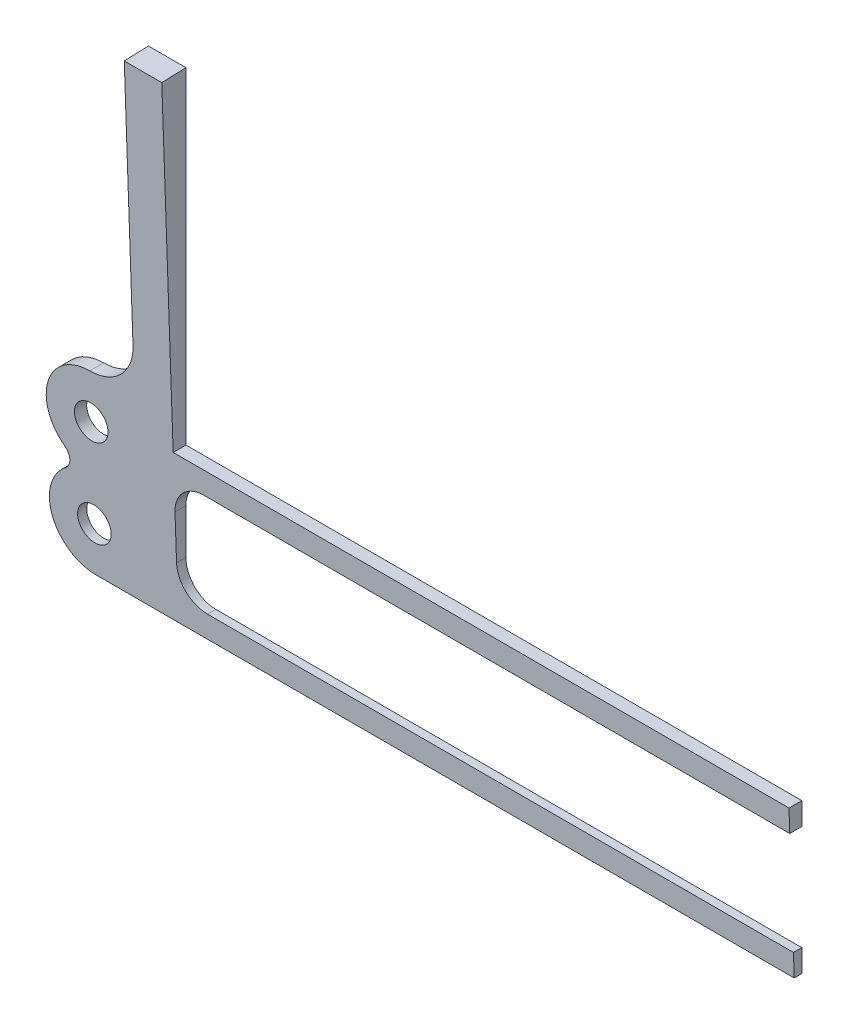
ISO-10303-21;
HEADER;
FILE_DESCRIPTION(('STEP AP214'),'2;1');
FILE_NAME('part.step','',(''),(''),'','','');
FILE_SCHEMA(('AUTOMOTIVE_DESIGN { 1 0 10303 214 1 1 1 1 }'));
ENDSEC;
DATA;
#1=APPLICATION_CONTEXT('core data for automotive mechanical design processes');
#2=APPLICATION_PROTOCOL_DEFINITION('international standard','automotive_design',2000,#1);
#3=PRODUCT_CONTEXT('',#1,'mechanical');
#4=PRODUCT('Part','Part','',(#3));
#5=PRODUCT_RELATED_PRODUCT_CATEGORY('part','',(#4));
#6=PRODUCT_DEFINITION_FORMATION('','',#4);
#7=PRODUCT_DEFINITION_CONTEXT('part definition',#1,'design');
#8=PRODUCT_DEFINITION('design','',#6,#7);
#9=PRODUCT_DEFINITION_SHAPE('','',#8);
#10=(LENGTH_UNIT() NAMED_UNIT(*) SI_UNIT(.MILLI.,.METRE.));
#11=(NAMED_UNIT(*) PLANE_ANGLE_UNIT() SI_UNIT($,.RADIAN.));
#12=(NAMED_UNIT(*) SI_UNIT($,.STERADIAN.) SOLID_ANGLE_UNIT());
#13=UNCERTAINTY_MEASURE_WITH_UNIT(LENGTH_MEASURE(1.E-05),#10,'distance_accuracy_value','');
#14=(GEOMETRIC_REPRESENTATION_CONTEXT(3) GLOBAL_UNCERTAINTY_ASSIGNED_CONTEXT((#13)) GLOBAL_UNIT_ASSIGNED_CONTEXT((#10,
#11,#12)) REPRESENTATION_CONTEXT('',''));
#15=CARTESIAN_POINT('',(0.,0.,0.));
#16=DIRECTION('',(0.,0.,1.));
#17=DIRECTION('',(1.,0.,0.));
#18=AXIS2_PLACEMENT_3D('',#15,#16,#17);
#19=CARTESIAN_POINT('',(0.,9.52500000000004,76.2));
#20=DIRECTION('',(0.,-1.,0.));
#21=DIRECTION('',(1.,0.,0.));
#22=AXIS2_PLACEMENT_3D('',#19,#20,#21);
#23=PLANE('',#22);
#24=DIRECTION('',(1.,0.,0.));
#25=VECTOR('',#24,1.);
#26=CARTESIAN_POINT('',(0.,9.52500000000004,2.70893443136311));
#27=LINE('',#26,#25);
#28=CARTESIAN_POINT('',(-268.897099999997,9.52500000000005,2.7089344313631));
#29=VERTEX_POINT('',#28);
#30=CARTESIAN_POINT('',(-138.423649999999,9.52500000000006,2.7089344313631));
#31=VERTEX_POINT('',#30);
#32=EDGE_CURVE('E169',#29,#31,#27,.T.);
#33=ORIENTED_EDGE('',*,*,#32,.T.);
#34=DIRECTION('',(0.,0.,-1.));
#35=VECTOR('',#34,1.);
#36=CARTESIAN_POINT('',(-138.423649999999,9.52500000000004,76.2));
#37=LINE('',#36,#35);
#38=CARTESIAN_POINT('',(-138.423649999999,9.52500000000005,0.));
#39=VERTEX_POINT('',#38);
#40=EDGE_CURVE('E316',#31,#39,#37,.T.);
#41=ORIENTED_EDGE('',*,*,#40,.T.);
#42=DIRECTION('',(-1.,0.,0.));
#43=VECTOR('',#42,1.);
#44=CARTESIAN_POINT('',(0.,9.52500000000004,0.));
#45=LINE('',#44,#43);
#46=CARTESIAN_POINT('',(-268.897099999997,9.52500000000005,0.));
#47=VERTEX_POINT('',#46);
#48=EDGE_CURVE('E197',#39,#47,#45,.T.);
#49=ORIENTED_EDGE('',*,*,#48,.T.);
#50=DIRECTION('',(0.,0.,-1.));
#51=VECTOR('',#50,1.);
#52=CARTESIAN_POINT('',(-268.897099999997,9.52500000000005,76.2));
#53=LINE('',#52,#51);
#54=EDGE_CURVE('E207',#29,#47,#53,.T.);
#55=ORIENTED_EDGE('',*,*,#54,.F.);
#56=EDGE_LOOP('',(#33,#41,#49,#55));
#57=FACE_BOUND('',#56,.T.);
#58=ADVANCED_FACE('F35',(#57),#23,.F.);
#59=CARTESIAN_POINT('',(-268.897099999997,0.,76.2));
#60=DIRECTION('',(-1.,0.,0.));
#61=DIRECTION('',(0.,0.,1.));
#62=AXIS2_PLACEMENT_3D('',#59,#60,#61);
#63=PLANE('',#62);
#64=DIRECTION('',(0.,1.,0.));
#65=VECTOR('',#64,1.);
#66=CARTESIAN_POINT('',(-268.897099999997,0.,0.));
#67=LINE('',#66,#65);
#68=CARTESIAN_POINT('',(-268.897099999997,78.7664171628417,0.));
#69=VERTEX_POINT('',#68);
#70=EDGE_CURVE('E162',#47,#69,#67,.T.);
#71=ORIENTED_EDGE('',*,*,#70,.T.);
#72=DIRECTION('',(0.,-0.0348994967025044,0.999390827019096));
#73=VECTOR('',#72,1.);
#74=CARTESIAN_POINT('',(-268.897099999997,76.012759996479,78.8544240702688));
#75=LINE('',#74,#73);
#76=CARTESIAN_POINT('',(-268.897099999997,78.5876000000001,5.12065356646412));
#77=VERTEX_POINT('',#76);
#78=EDGE_CURVE('E148',#69,#77,#75,.T.);
#79=ORIENTED_EDGE('',*,*,#78,.T.);
#80=DIRECTION('',(0.,-0.999390827019096,-0.0348994967025044));
#81=VECTOR('',#80,1.);
#82=CARTESIAN_POINT('',(-268.897099999997,2.57484000352105,2.46622949619527));
#83=LINE('',#82,#81);
#84=EDGE_CURVE('E159',#77,#29,#83,.T.);
#85=ORIENTED_EDGE('',*,*,#84,.T.);
#86=ORIENTED_EDGE('',*,*,#54,.T.);
#87=EDGE_LOOP('',(#71,#79,#85,#86));
#88=FACE_BOUND('',#87,.T.);
#89=ADVANCED_FACE('F157',(#88),#63,.F.);
#90=CARTESIAN_POINT('',(0.,-22.225,76.2));
#91=DIRECTION('',(0.,1.,0.));
#92=DIRECTION('',(0.,0.,1.));
#93=AXIS2_PLACEMENT_3D('',#90,#91,#92);
#94=PLANE('',#93);
#95=DIRECTION('',(1.,0.,0.));
#96=VECTOR('',#95,1.);
#97=CARTESIAN_POINT('',(0.,-22.225,0.));
#98=LINE('',#97,#96);
#99=CARTESIAN_POINT('',(-286.359599999998,-22.225,0.));
#100=VERTEX_POINT('',#99);
#101=CARTESIAN_POINT('',(-138.423649999999,-22.225,0.));
#102=VERTEX_POINT('',#101);
#103=EDGE_CURVE('E184',#100,#102,#98,.T.);
#104=ORIENTED_EDGE('',*,*,#103,.T.);
#105=DIRECTION('',(0.,0.,1.));
#106=VECTOR('',#105,1.);
#107=CARTESIAN_POINT('',(-138.423649999999,-22.225,76.2));
#108=LINE('',#107,#106);
#109=CARTESIAN_POINT('',(-138.423649999999,-22.225,1.6002));
#110=VERTEX_POINT('',#109);
#111=EDGE_CURVE('E272',#102,#110,#108,.T.);
#112=ORIENTED_EDGE('',*,*,#111,.T.);
#113=DIRECTION('',(-1.,0.,0.));
#114=VECTOR('',#113,1.);
#115=CARTESIAN_POINT('',(19.0500000000025,-22.225,1.6002));
#116=LINE('',#115,#114);
#117=CARTESIAN_POINT('',(-286.359599999998,-22.225,1.6002));
#118=VERTEX_POINT('',#117);
#119=EDGE_CURVE('E281',#110,#118,#116,.T.);
#120=ORIENTED_EDGE('',*,*,#119,.T.);
#121=DIRECTION('',(0.,0.,-1.));
#122=VECTOR('',#121,1.);
#123=CARTESIAN_POINT('',(-286.359599999998,-22.225,76.2));
#124=LINE('',#123,#122);
#125=EDGE_CURVE('E206',#118,#100,#124,.T.);
#126=ORIENTED_EDGE('',*,*,#125,.T.);
#127=EDGE_LOOP('',(#104,#112,#120,#126));
#128=FACE_BOUND('',#127,.T.);
#129=ADVANCED_FACE('F311',(#128),#94,.F.);
#130=CARTESIAN_POINT('',(-276.847299999997,0.,76.2));
#131=DIRECTION('',(1.,0.,0.));
#132=DIRECTION('',(0.,0.,-1.));
#133=AXIS2_PLACEMENT_3D('',#130,#131,#132);
#134=PLANE('',#133);
#135=DIRECTION('',(0.,0.999390827019096,0.0348994967025044));
#136=VECTOR('',#135,1.);
#137=CARTESIAN_POINT('',(-276.847299999997,2.57484000352105,2.46622949619527));
#138=LINE('',#137,#136);
#139=CARTESIAN_POINT('',(-276.847299999997,25.4,3.26330164704465));
#140=VERTEX_POINT('',#139);
#141=CARTESIAN_POINT('',(-276.847299999997,78.5876000000001,5.12065356646412));
#142=VERTEX_POINT('',#141);
#143=EDGE_CURVE('E171',#140,#142,#138,.T.);
#144=ORIENTED_EDGE('',*,*,#143,.T.);
#145=DIRECTION('',(0.,0.0348994967025044,-0.999390827019096));
#146=VECTOR('',#145,1.);
#147=CARTESIAN_POINT('',(-276.847299999997,76.012759996479,78.8544240702688));
#148=LINE('',#147,#146);
#149=CARTESIAN_POINT('',(-276.847299999997,78.7664171628417,0.));
#150=VERTEX_POINT('',#149);
#151=EDGE_CURVE('E50',#142,#150,#148,.T.);
#152=ORIENTED_EDGE('',*,*,#151,.T.);
#153=DIRECTION('',(0.,-1.,0.));
#154=VECTOR('',#153,1.);
#155=CARTESIAN_POINT('',(-276.847299999997,0.,0.));
#156=LINE('',#155,#154);
#157=CARTESIAN_POINT('',(-276.847299999997,25.4,0.));
#158=VERTEX_POINT('',#157);
#159=EDGE_CURVE('E187',#150,#158,#156,.T.);
#160=ORIENTED_EDGE('',*,*,#159,.T.);
#161=DIRECTION('',(0.,0.,-1.));
#162=VECTOR('',#161,1.);
#163=CARTESIAN_POINT('',(-276.847299999997,25.4,76.2));
#164=LINE('',#163,#162);
#165=EDGE_CURVE('E210',#140,#158,#164,.T.);
#166=ORIENTED_EDGE('',*,*,#165,.F.);
#167=EDGE_LOOP('',(#144,#152,#160,#166));
#168=FACE_BOUND('',#167,.T.);
#169=ADVANCED_FACE('F327',(#168),#134,.F.);
#170=CARTESIAN_POINT('',(-286.372299999997,25.4,76.2));
#171=DIRECTION('',(0.,0.,-1.));
#172=DIRECTION('',(-1.,0.,0.));
#173=AXIS2_PLACEMENT_3D('',#170,#171,#172);
#174=CYLINDRICAL_SURFACE('',#173,9.525);
#175=CARTESIAN_POINT('',(-286.372299999997,25.4,3.26330164704465));
#176=DIRECTION('',(0.,0.0348994967025044,-0.999390827019096));
#177=DIRECTION('',(0.,-0.999390827019096,-0.0348994967025044));
#178=AXIS2_PLACEMENT_3D('',#175,#176,#177);
#179=ELLIPSE('',#178,9.53080590944628,9.525);
#180=CARTESIAN_POINT('',(-286.372299999997,15.875,2.93068131763571));
#181=VERTEX_POINT('',#180);
#182=EDGE_CURVE('E175',#140,#181,#179,.T.);
#183=ORIENTED_EDGE('',*,*,#182,.F.);
#184=ORIENTED_EDGE('',*,*,#165,.T.);
#185=CARTESIAN_POINT('',(-286.372299999997,25.4,0.));
#186=DIRECTION('',(0.,0.,1.));
#187=DIRECTION('',(1.,0.,0.));
#188=AXIS2_PLACEMENT_3D('',#185,#186,#187);
#189=CIRCLE('',#188,9.525);
#190=CARTESIAN_POINT('',(-286.372299999997,15.875,0.));
#191=VERTEX_POINT('',#190);
#192=EDGE_CURVE('E189',#191,#158,#189,.T.);
#193=ORIENTED_EDGE('',*,*,#192,.F.);
#194=DIRECTION('',(0.,0.,-1.));
#195=VECTOR('',#194,1.);
#196=CARTESIAN_POINT('',(-286.372299999997,15.875,76.2));
#197=LINE('',#196,#195);
#198=EDGE_CURVE('E213',#181,#191,#197,.T.);
#199=ORIENTED_EDGE('',*,*,#198,.F.);
#200=EDGE_LOOP('',(#183,#184,#193,#199));
#201=FACE_BOUND('',#200,.T.);
#202=ADVANCED_FACE('F295',(#201),#174,.F.);
#203=CARTESIAN_POINT('',(-286.372299999997,6.35000000000004,76.2));
#204=DIRECTION('',(0.,0.,-1.));
#205=DIRECTION('',(-1.,0.,0.));
#206=AXIS2_PLACEMENT_3D('',#203,#204,#205);
#207=CYLINDRICAL_SURFACE('',#206,9.525);
#208=CARTESIAN_POINT('',(-286.372299999997,6.35000000000004,0.));
#209=DIRECTION('',(0.,0.,1.));
#210=DIRECTION('',(1.,0.,0.));
#211=AXIS2_PLACEMENT_3D('',#208,#209,#210);
#212=CIRCLE('',#211,9.525);
#213=CARTESIAN_POINT('',(-292.213579898648,-1.17363437080932,0.));
#214=VERTEX_POINT('',#213);
#215=EDGE_CURVE('E192',#191,#214,#212,.T.);
#216=ORIENTED_EDGE('',*,*,#215,.T.);
#217=DIRECTION('',(0.,0.,-1.));
#218=VECTOR('',#217,1.);
#219=CARTESIAN_POINT('',(-292.213579898648,-1.17363437080932,76.2));
#220=LINE('',#219,#218);
#221=CARTESIAN_POINT('',(-292.213579898648,-1.17363437080932,2.33532988662354));
#222=VERTEX_POINT('',#221);
#223=EDGE_CURVE('E219',#214,#222,#220,.F.);
#224=ORIENTED_EDGE('',*,*,#223,.T.);
#225=CARTESIAN_POINT('',(-286.372299999997,6.35000000000004,2.59806098822679));
#226=DIRECTION('',(0.,0.0348994967025044,-0.999390827019096));
#227=DIRECTION('',(0.,-0.999390827019096,-0.0348994967025044));
#228=AXIS2_PLACEMENT_3D('',#225,#226,#227);
#229=ELLIPSE('',#228,9.53080590944628,9.525);
#230=EDGE_CURVE('E286',#222,#181,#229,.T.);
#231=ORIENTED_EDGE('',*,*,#230,.T.);
#232=ORIENTED_EDGE('',*,*,#198,.T.);
#233=EDGE_LOOP('',(#216,#224,#231,#232));
#234=FACE_BOUND('',#233,.T.);
#235=ADVANCED_FACE('F298',(#234),#207,.T.);
#236=CARTESIAN_POINT('',(-286.359599999998,-12.7,76.2));
#237=DIRECTION('',(0.,0.,-1.));
#238=DIRECTION('',(-1.,0.,0.));
#239=AXIS2_PLACEMENT_3D('',#236,#237,#238);
#240=CYLINDRICAL_SURFACE('',#239,3.55600000000001);
#241=CARTESIAN_POINT('',(-286.359599999998,-12.7,1.93282032940893));
#242=DIRECTION('',(0.,0.0348994967025044,-0.999390827019096));
#243=DIRECTION('',(0.,-0.999390827019096,-0.0348994967025044));
#244=AXIS2_PLACEMENT_3D('',#241,#242,#243);
#245=ELLIPSE('',#244,3.55816753952662,3.55600000000001);
#246=CARTESIAN_POINT('',(-286.359599999998,-16.256,1.80864207309626));
#247=VERTEX_POINT('',#246);
#248=EDGE_CURVE('E181',#247,#247,#245,.T.);
#249=ORIENTED_EDGE('',*,*,#248,.F.);
#250=EDGE_LOOP('',(#249));
#251=FACE_BOUND('',#250,.T.);
#252=CARTESIAN_POINT('',(-286.359599999998,-12.7,0.));
#253=DIRECTION('',(0.,0.,1.));
#254=DIRECTION('',(1.,0.,0.));
#255=AXIS2_PLACEMENT_3D('',#252,#253,#254);
#256=CIRCLE('',#255,3.55600000000001);
#257=CARTESIAN_POINT('',(-282.803599999998,-12.7,0.));
#258=VERTEX_POINT('',#257);
#259=EDGE_CURVE('E203',#258,#258,#256,.T.);
#260=ORIENTED_EDGE('',*,*,#259,.F.);
#261=EDGE_LOOP('',(#260));
#262=FACE_BOUND('',#261,.T.);
#263=ADVANCED_FACE('F349',(#251,#262),#240,.F.);
#264=CARTESIAN_POINT('',(-286.372299999997,6.35000000000004,76.2));
#265=DIRECTION('',(0.,0.,-1.));
#266=DIRECTION('',(-1.,0.,0.));
#267=AXIS2_PLACEMENT_3D('',#264,#265,#266);
#268=CYLINDRICAL_SURFACE('',#267,3.55600000000001);
#269=CARTESIAN_POINT('',(-286.372299999997,6.35000000000004,2.59806098822679));
#270=DIRECTION('',(0.,0.0348994967025044,-0.999390827019096));
#271=DIRECTION('',(0.,-0.999390827019096,-0.0348994967025044));
#272=AXIS2_PLACEMENT_3D('',#269,#270,#271);
#273=ELLIPSE('',#272,3.55816753952662,3.55600000000001);
#274=CARTESIAN_POINT('',(-286.372299999997,2.79400000000003,2.47388273191412));
#275=VERTEX_POINT('',#274);
#276=EDGE_CURVE('E173',#275,#275,#273,.T.);
#277=ORIENTED_EDGE('',*,*,#276,.F.);
#278=EDGE_LOOP('',(#277));
#279=FACE_BOUND('',#278,.T.);
#280=CARTESIAN_POINT('',(-286.372299999997,6.35000000000004,0.));
#281=DIRECTION('',(0.,0.,1.));
#282=DIRECTION('',(1.,0.,0.));
#283=AXIS2_PLACEMENT_3D('',#280,#281,#282);
#284=CIRCLE('',#283,3.55600000000001);
#285=CARTESIAN_POINT('',(-282.816299999997,6.35000000000004,0.));
#286=VERTEX_POINT('',#285);
#287=EDGE_CURVE('E200',#286,#286,#284,.T.);
#288=ORIENTED_EDGE('',*,*,#287,.F.);
#289=EDGE_LOOP('',(#288));
#290=FACE_BOUND('',#289,.T.);
#291=ADVANCED_FACE('F347',(#279,#290),#268,.F.);
#292=CARTESIAN_POINT('',(-286.359599999998,-12.7,76.2));
#293=DIRECTION('',(0.,0.,-1.));
#294=DIRECTION('',(-1.,0.,0.));
#295=AXIS2_PLACEMENT_3D('',#292,#293,#294);
#296=CYLINDRICAL_SURFACE('',#295,9.525);
#297=CARTESIAN_POINT('',(-286.359599999998,-12.7,1.93282032940893));
#298=DIRECTION('',(0.,0.0348994967025044,-0.999390827019096));
#299=DIRECTION('',(0.,-0.999390827019096,-0.0348994967025044));
#300=AXIS2_PLACEMENT_3D('',#297,#298,#299);
#301=ELLIPSE('',#300,9.53080590944628,9.525);
#302=CARTESIAN_POINT('',(-292.210906214437,-5.18416068659879,2.19527922160926));
#303=VERTEX_POINT('',#302);
#304=EDGE_CURVE('E283',#118,#303,#301,.T.);
#305=ORIENTED_EDGE('',*,*,#304,.T.);
#306=DIRECTION('',(0.,0.,-1.));
#307=VECTOR('',#306,1.);
#308=CARTESIAN_POINT('',(-292.210906214437,-5.18416068659879,76.2));
#309=LINE('',#308,#307);
#310=CARTESIAN_POINT('',(-292.210906214437,-5.18416068659879,0.));
#311=VERTEX_POINT('',#310);
#312=EDGE_CURVE('E209',#303,#311,#309,.T.);
#313=ORIENTED_EDGE('',*,*,#312,.T.);
#314=CARTESIAN_POINT('',(-286.359599999998,-12.7,0.));
#315=DIRECTION('',(0.,0.,1.));
#316=DIRECTION('',(1.,0.,0.));
#317=AXIS2_PLACEMENT_3D('',#314,#315,#316);
#318=CIRCLE('',#317,9.525);
#319=EDGE_CURVE('E195',#311,#100,#318,.T.);
#320=ORIENTED_EDGE('',*,*,#319,.T.);
#321=ORIENTED_EDGE('',*,*,#125,.F.);
#322=EDGE_LOOP('',(#305,#313,#320,#321));
#323=FACE_BOUND('',#322,.T.);
#324=ADVANCED_FACE('F306',(#323),#296,.T.);
#325=CARTESIAN_POINT('',(0.,0.,0.));
#326=DIRECTION('',(0.,0.,1.));
#327=DIRECTION('',(1.,0.,0.));
#328=AXIS2_PLACEMENT_3D('',#325,#326,#327);
#329=PLANE('',#328);
#330=ORIENTED_EDGE('',*,*,#159,.F.);
#331=DIRECTION('',(1.,0.,0.));
#332=VECTOR('',#331,1.);
#333=CARTESIAN_POINT('',(0.,78.7664171628417,0.));
#334=LINE('',#333,#332);
#335=EDGE_CURVE('E153',#150,#69,#334,.T.);
#336=ORIENTED_EDGE('',*,*,#335,.T.);
#337=ORIENTED_EDGE('',*,*,#70,.F.);
#338=ORIENTED_EDGE('',*,*,#48,.F.);
#339=DIRECTION('',(0.,-1.,0.));
#340=VECTOR('',#339,1.);
#341=CARTESIAN_POINT('',(-138.423649999999,0.,0.));
#342=LINE('',#341,#340);
#343=CARTESIAN_POINT('',(-138.423649999999,4.74980000000005,0.));
#344=VERTEX_POINT('',#343);
#345=EDGE_CURVE('E315',#39,#344,#342,.T.);
#346=ORIENTED_EDGE('',*,*,#345,.T.);
#347=DIRECTION('',(1.,0.,0.));
#348=VECTOR('',#347,1.);
#349=CARTESIAN_POINT('',(-7.95019999999749,4.74980000000006,0.));
#350=LINE('',#349,#348);
#351=CARTESIAN_POINT('',(-262.547099999997,4.74980000000005,0.));
#352=VERTEX_POINT('',#351);
#353=EDGE_CURVE('E271',#352,#344,#350,.T.);
#354=ORIENTED_EDGE('',*,*,#353,.F.);
#355=CARTESIAN_POINT('',(-262.547099999997,-1.60019999999995,0.));
#356=DIRECTION('',(0.,0.,1.));
#357=DIRECTION('',(1.,0.,0.));
#358=AXIS2_PLACEMENT_3D('',#355,#356,#357);
#359=CIRCLE('',#358,6.35);
#360=CARTESIAN_POINT('',(-268.897099999997,-1.60019999999995,0.));
#361=VERTEX_POINT('',#360);
#362=EDGE_CURVE('E244',#352,#361,#359,.T.);
#363=ORIENTED_EDGE('',*,*,#362,.T.);
#364=DIRECTION('',(0.,1.,0.));
#365=VECTOR('',#364,1.);
#366=CARTESIAN_POINT('',(-268.897099999997,4.74980000000005,0.));
#367=LINE('',#366,#365);
#368=CARTESIAN_POINT('',(-268.897099999997,-11.0998,0.));
#369=VERTEX_POINT('',#368);
#370=EDGE_CURVE('E269',#369,#361,#367,.T.);
#371=ORIENTED_EDGE('',*,*,#370,.F.);
#372=CARTESIAN_POINT('',(-262.547099999997,-11.0998,0.));
#373=DIRECTION('',(0.,0.,1.));
#374=DIRECTION('',(1.,0.,0.));
#375=AXIS2_PLACEMENT_3D('',#372,#373,#374);
#376=CIRCLE('',#375,6.35);
#377=CARTESIAN_POINT('',(-262.547099999997,-17.4498,0.));
#378=VERTEX_POINT('',#377);
#379=EDGE_CURVE('E248',#369,#378,#376,.T.);
#380=ORIENTED_EDGE('',*,*,#379,.T.);
#381=DIRECTION('',(-1.,0.,0.));
#382=VECTOR('',#381,1.);
#383=CARTESIAN_POINT('',(-268.897099999997,-17.4498,0.));
#384=LINE('',#383,#382);
#385=CARTESIAN_POINT('',(-138.423649999999,-17.4498,0.));
#386=VERTEX_POINT('',#385);
#387=EDGE_CURVE('E268',#386,#378,#384,.T.);
#388=ORIENTED_EDGE('',*,*,#387,.F.);
#389=EDGE_CURVE('E58',#386,#102,#342,.T.);
#390=ORIENTED_EDGE('',*,*,#389,.T.);
#391=ORIENTED_EDGE('',*,*,#103,.F.);
#392=ORIENTED_EDGE('',*,*,#319,.F.);
#393=CARTESIAN_POINT('',(-293.771254538288,-3.17993686969182,0.));
#394=DIRECTION('',(0.,0.,1.));
#395=DIRECTION('',(1.,0.,0.));
#396=AXIS2_PLACEMENT_3D('',#393,#394,#395);
#397=CIRCLE('',#396,2.54);
#398=EDGE_CURVE('E221',#311,#214,#397,.T.);
#399=ORIENTED_EDGE('',*,*,#398,.T.);
#400=ORIENTED_EDGE('',*,*,#215,.F.);
#401=ORIENTED_EDGE('',*,*,#192,.T.);
#402=EDGE_LOOP('',(#330,#336,#337,#338,#346,#354,#363,#371,#380,#388,#390,#391,#392,#399,#400,#401));
#403=FACE_BOUND('',#402,.T.);
#404=ORIENTED_EDGE('',*,*,#287,.T.);
#405=EDGE_LOOP('',(#404));
#406=FACE_BOUND('',#405,.T.);
#407=ORIENTED_EDGE('',*,*,#259,.T.);
#408=EDGE_LOOP('',(#407));
#409=FACE_BOUND('',#408,.T.);
#410=ADVANCED_FACE('F266',(#403,#406,#409),#329,.F.);
#411=CARTESIAN_POINT('',(19.0500000000025,-22.225,1.6002));
#412=DIRECTION('',(0.,0.0348994967025044,-0.999390827019096));
#413=DIRECTION('',(0.,0.999390827019096,0.0348994967025044));
#414=AXIS2_PLACEMENT_3D('',#411,#412,#413);
#415=PLANE('',#414);
#416=ORIENTED_EDGE('',*,*,#84,.F.);
#417=DIRECTION('',(1.,0.,0.));
#418=VECTOR('',#417,1.);
#419=CARTESIAN_POINT('',(-138.423649999999,78.5876000000001,5.12065356646412));
#420=LINE('',#419,#418);
#421=EDGE_CURVE('E145',#142,#77,#420,.T.);
#422=ORIENTED_EDGE('',*,*,#421,.F.);
#423=ORIENTED_EDGE('',*,*,#143,.F.);
#424=ORIENTED_EDGE('',*,*,#182,.T.);
#425=ORIENTED_EDGE('',*,*,#230,.F.);
#426=CARTESIAN_POINT('',(-293.771254538288,-3.17993686969182,2.26526825952934));
#427=DIRECTION('',(0.,0.0348994967025044,-0.999390827019096));
#428=DIRECTION('',(0.,0.999390827019096,0.0348994967025044));
#429=AXIS2_PLACEMENT_3D('',#426,#427,#428);
#430=ELLIPSE('',#429,2.54154824251901,2.54);
#431=EDGE_CURVE('E223',#222,#303,#430,.T.);
#432=ORIENTED_EDGE('',*,*,#431,.T.);
#433=ORIENTED_EDGE('',*,*,#304,.F.);
#434=ORIENTED_EDGE('',*,*,#119,.F.);
#435=DIRECTION('',(0.,-0.999390827019096,-0.0348994967025044));
#436=VECTOR('',#435,1.);
#437=CARTESIAN_POINT('',(-138.423649999999,-42.9005162307363,0.878195063583495));
#438=LINE('',#437,#436);
#439=CARTESIAN_POINT('',(-138.423649999999,-17.4497999999999,1.76695365847701));
#440=VERTEX_POINT('',#439);
#441=EDGE_CURVE('E163',#440,#110,#438,.T.);
#442=ORIENTED_EDGE('',*,*,#441,.F.);
#443=DIRECTION('',(-1.,0.,0.));
#444=VECTOR('',#443,1.);
#445=CARTESIAN_POINT('',(19.0500000000025,-17.4497999999999,1.76695365847701));
#446=LINE('',#445,#444);
#447=CARTESIAN_POINT('',(-262.547099999997,-17.4498,1.76695365847701));
#448=VERTEX_POINT('',#447);
#449=EDGE_CURVE('E228',#440,#448,#446,.T.);
#450=ORIENTED_EDGE('',*,*,#449,.T.);
#451=CARTESIAN_POINT('',(-262.547099999997,-11.0998,1.98870054474963));
#452=DIRECTION('',(0.,0.0348994967025044,-0.999390827019096));
#453=DIRECTION('',(0.,0.999390827019096,0.0348994967025044));
#454=AXIS2_PLACEMENT_3D('',#451,#452,#453);
#455=ELLIPSE('',#454,6.35387060629752,6.35);
#456=CARTESIAN_POINT('',(-268.897099999997,-11.0998,1.98870054474963));
#457=VERTEX_POINT('',#456);
#458=EDGE_CURVE('E43',#448,#457,#455,.T.);
#459=ORIENTED_EDGE('',*,*,#458,.T.);
#460=DIRECTION('',(0.,0.999390827019096,0.0348994967025044));
#461=VECTOR('',#460,1.);
#462=CARTESIAN_POINT('',(-268.897099999997,-22.225,1.6002));
#463=LINE('',#462,#461);
#464=CARTESIAN_POINT('',(-268.897099999997,-1.60019999999995,2.32043388661347));
#465=VERTEX_POINT('',#464);
#466=EDGE_CURVE('E230',#457,#465,#463,.T.);
#467=ORIENTED_EDGE('',*,*,#466,.T.);
#468=CARTESIAN_POINT('',(-262.547099999997,-1.60019999999995,2.32043388661347));
#469=DIRECTION('',(0.,0.0348994967025044,-0.999390827019096));
#470=DIRECTION('',(0.,0.999390827019096,0.0348994967025044));
#471=AXIS2_PLACEMENT_3D('',#468,#469,#470);
#472=ELLIPSE('',#471,6.35387060629752,6.35);
#473=CARTESIAN_POINT('',(-262.547099999997,4.74980000000005,2.54218077288609));
#474=VERTEX_POINT('',#473);
#475=EDGE_CURVE('E246',#465,#474,#472,.T.);
#476=ORIENTED_EDGE('',*,*,#475,.T.);
#477=DIRECTION('',(1.,0.,0.));
#478=VECTOR('',#477,1.);
#479=CARTESIAN_POINT('',(19.0500000000025,4.74980000000006,2.54218077288609));
#480=LINE('',#479,#478);
#481=CARTESIAN_POINT('',(-138.423649999999,4.74980000000005,2.54218077288609));
#482=VERTEX_POINT('',#481);
#483=EDGE_CURVE('E225',#474,#482,#480,.T.);
#484=ORIENTED_EDGE('',*,*,#483,.T.);
#485=EDGE_CURVE('E320',#31,#482,#438,.T.);
#486=ORIENTED_EDGE('',*,*,#485,.F.);
#487=ORIENTED_EDGE('',*,*,#32,.F.);
#488=EDGE_LOOP('',(#416,#422,#423,#424,#425,#432,#433,#434,#442,#450,#459,#467,#476,#484,#486,#487));
#489=FACE_BOUND('',#488,.T.);
#490=ORIENTED_EDGE('',*,*,#248,.T.);
#491=EDGE_LOOP('',(#490));
#492=FACE_BOUND('',#491,.T.);
#493=ORIENTED_EDGE('',*,*,#276,.T.);
#494=EDGE_LOOP('',(#493));
#495=FACE_BOUND('',#494,.T.);
#496=ADVANCED_FACE('F165',(#489,#492,#495),#415,.F.);
#497=CARTESIAN_POINT('',(-293.771254538288,-3.17993686969182,76.2));
#498=DIRECTION('',(0.,0.,1.));
#499=DIRECTION('',(1.,0.,0.));
#500=AXIS2_PLACEMENT_3D('',#497,#498,#499);
#501=CYLINDRICAL_SURFACE('',#500,2.54);
#502=ORIENTED_EDGE('',*,*,#431,.F.);
#503=ORIENTED_EDGE('',*,*,#223,.F.);
#504=ORIENTED_EDGE('',*,*,#398,.F.);
#505=ORIENTED_EDGE('',*,*,#312,.F.);
#506=EDGE_LOOP('',(#502,#503,#504,#505));
#507=FACE_BOUND('',#506,.T.);
#508=ADVANCED_FACE('F304',(#507),#501,.F.);
#509=CARTESIAN_POINT('',(-268.897099999997,4.74980000000005,8.64110713292829));
#510=DIRECTION('',(-1.,0.,0.));
#511=DIRECTION('',(0.,0.,1.));
#512=AXIS2_PLACEMENT_3D('',#509,#510,#511);
#513=PLANE('',#512);
#514=ORIENTED_EDGE('',*,*,#370,.T.);
#515=DIRECTION('',(0.,0.,-1.));
#516=VECTOR('',#515,1.);
#517=CARTESIAN_POINT('',(-268.897099999997,-1.60019999999995,2.54218077288609));
#518=LINE('',#517,#516);
#519=EDGE_CURVE('E239',#361,#465,#518,.F.);
#520=ORIENTED_EDGE('',*,*,#519,.T.);
#521=ORIENTED_EDGE('',*,*,#466,.F.);
#522=DIRECTION('',(0.,0.,-1.));
#523=VECTOR('',#522,1.);
#524=CARTESIAN_POINT('',(-268.897099999997,-11.0998,0.));
#525=LINE('',#524,#523);
#526=EDGE_CURVE('E236',#457,#369,#525,.T.);
#527=ORIENTED_EDGE('',*,*,#526,.T.);
#528=EDGE_LOOP('',(#514,#520,#521,#527));
#529=FACE_BOUND('',#528,.T.);
#530=ADVANCED_FACE('F260',(#529),#513,.F.);
#531=CARTESIAN_POINT('',(-268.897099999997,-17.4498,8.64110713292829));
#532=DIRECTION('',(0.,-1.,0.));
#533=DIRECTION('',(1.,0.,0.));
#534=AXIS2_PLACEMENT_3D('',#531,#532,#533);
#535=PLANE('',#534);
#536=ORIENTED_EDGE('',*,*,#449,.F.);
#537=DIRECTION('',(0.,0.,-1.));
#538=VECTOR('',#537,1.);
#539=CARTESIAN_POINT('',(-138.423649999999,-17.4498,8.64110713292829));
#540=LINE('',#539,#538);
#541=EDGE_CURVE('E313',#440,#386,#540,.T.);
#542=ORIENTED_EDGE('',*,*,#541,.T.);
#543=ORIENTED_EDGE('',*,*,#387,.T.);
#544=DIRECTION('',(0.,0.,-1.));
#545=VECTOR('',#544,1.);
#546=CARTESIAN_POINT('',(-262.547099999997,-17.4498,1.76695365847701));
#547=LINE('',#546,#545);
#548=EDGE_CURVE('E241',#378,#448,#547,.F.);
#549=ORIENTED_EDGE('',*,*,#548,.T.);
#550=EDGE_LOOP('',(#536,#542,#543,#549));
#551=FACE_BOUND('',#550,.T.);
#552=ADVANCED_FACE('F368',(#551),#535,.F.);
#553=CARTESIAN_POINT('',(-7.95019999999749,4.74980000000006,8.64110713292829));
#554=DIRECTION('',(0.,1.,0.));
#555=DIRECTION('',(-1.,0.,0.));
#556=AXIS2_PLACEMENT_3D('',#553,#554,#555);
#557=PLANE('',#556);
#558=ORIENTED_EDGE('',*,*,#353,.T.);
#559=DIRECTION('',(0.,0.,1.));
#560=VECTOR('',#559,1.);
#561=CARTESIAN_POINT('',(-138.423649999999,4.74980000000005,8.64110713292829));
#562=LINE('',#561,#560);
#563=EDGE_CURVE('E11',#344,#482,#562,.T.);
#564=ORIENTED_EDGE('',*,*,#563,.T.);
#565=ORIENTED_EDGE('',*,*,#483,.F.);
#566=DIRECTION('',(0.,0.,-1.));
#567=VECTOR('',#566,1.);
#568=CARTESIAN_POINT('',(-262.547099999997,4.74980000000005,0.));
#569=LINE('',#568,#567);
#570=EDGE_CURVE('E233',#474,#352,#569,.T.);
#571=ORIENTED_EDGE('',*,*,#570,.T.);
#572=EDGE_LOOP('',(#558,#564,#565,#571));
#573=FACE_BOUND('',#572,.T.);
#574=ADVANCED_FACE('F369',(#573),#557,.F.);
#575=CARTESIAN_POINT('',(-262.547099999997,-1.60019999999995,8.64110713292829));
#576=DIRECTION('',(0.,0.,1.));
#577=DIRECTION('',(1.,0.,0.));
#578=AXIS2_PLACEMENT_3D('',#575,#576,#577);
#579=CYLINDRICAL_SURFACE('',#578,6.35);
#580=ORIENTED_EDGE('',*,*,#475,.F.);
#581=ORIENTED_EDGE('',*,*,#519,.F.);
#582=ORIENTED_EDGE('',*,*,#362,.F.);
#583=ORIENTED_EDGE('',*,*,#570,.F.);
#584=EDGE_LOOP('',(#580,#581,#582,#583));
#585=FACE_BOUND('',#584,.T.);
#586=ADVANCED_FACE('F372',(#585),#579,.F.);
#587=CARTESIAN_POINT('',(-262.547099999997,-11.0998,8.64110713292829));
#588=DIRECTION('',(0.,0.,1.));
#589=DIRECTION('',(1.,0.,0.));
#590=AXIS2_PLACEMENT_3D('',#587,#588,#589);
#591=CYLINDRICAL_SURFACE('',#590,6.35);
#592=ORIENTED_EDGE('',*,*,#458,.F.);
#593=ORIENTED_EDGE('',*,*,#548,.F.);
#594=ORIENTED_EDGE('',*,*,#379,.F.);
#595=ORIENTED_EDGE('',*,*,#526,.F.);
#596=EDGE_LOOP('',(#592,#593,#594,#595));
#597=FACE_BOUND('',#596,.T.);
#598=ADVANCED_FACE('F37',(#597),#591,.F.);
#599=CARTESIAN_POINT('',(-138.423649999999,-42.5991296493172,-7.7523874180071));
#600=DIRECTION('',(-1.,0.,0.));
#601=DIRECTION('',(0.,0.,1.));
#602=AXIS2_PLACEMENT_3D('',#599,#600,#601);
#603=PLANE('',#602);
#604=ORIENTED_EDGE('',*,*,#485,.T.);
#605=ORIENTED_EDGE('',*,*,#563,.F.);
#606=ORIENTED_EDGE('',*,*,#345,.F.);
#607=ORIENTED_EDGE('',*,*,#40,.F.);
#608=EDGE_LOOP('',(#604,#605,#606,#607));
#609=FACE_BOUND('',#608,.T.);
#610=ADVANCED_FACE('F379',(#609),#603,.F.);
#611=ORIENTED_EDGE('',*,*,#389,.F.);
#612=ORIENTED_EDGE('',*,*,#541,.F.);
#613=ORIENTED_EDGE('',*,*,#441,.T.);
#614=ORIENTED_EDGE('',*,*,#111,.F.);
#615=EDGE_LOOP('',(#611,#612,#613,#614));
#616=FACE_BOUND('',#615,.T.);
#617=ADVANCED_FACE('F312',(#616),#603,.F.);
#618=CARTESIAN_POINT('',(-138.423649999999,78.8889865814193,-3.50992891512647));
#619=DIRECTION('',(0.,-0.999390827019096,-0.0348994967025044));
#620=DIRECTION('',(0.,0.0348994967025044,-0.999390827019096));
#621=AXIS2_PLACEMENT_3D('',#618,#619,#620);
#622=PLANE('',#621);
#623=ORIENTED_EDGE('',*,*,#335,.F.);
#624=ORIENTED_EDGE('',*,*,#151,.F.);
#625=ORIENTED_EDGE('',*,*,#421,.T.);
#626=ORIENTED_EDGE('',*,*,#78,.F.);
#627=EDGE_LOOP('',(#623,#624,#625,#626));
#628=FACE_BOUND('',#627,.T.);
#629=ADVANCED_FACE('F147',(#628),#622,.F.);
#630=CLOSED_SHELL('',(#58,#89,#129,#169,#202,#235,#263,#291,#324,#410,#496,#508,#530,#552,#574,
#586,#598,#610,#617,#629));
#631=MANIFOLD_SOLID_BREP('B2',#630);
#632=ADVANCED_BREP_SHAPE_REPRESENTATION('',(#18,#631),#14);
#633=SHAPE_DEFINITION_REPRESENTATION(#9,#632);
ENDSEC;
END-ISO-10303-21;
